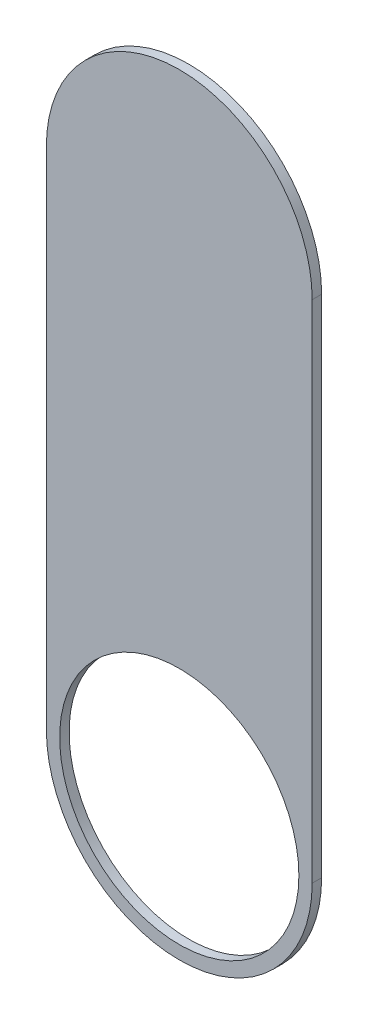
ISO-10303-21;
HEADER;
FILE_DESCRIPTION(('STEP AP214'),'2;1');
FILE_NAME('part.step','',(''),(''),'','','');
FILE_SCHEMA(('AUTOMOTIVE_DESIGN { 1 0 10303 214 1 1 1 1 }'));
ENDSEC;
DATA;
#1=APPLICATION_CONTEXT('core data for automotive mechanical design processes');
#2=APPLICATION_PROTOCOL_DEFINITION('international standard','automotive_design',2000,#1);
#3=PRODUCT_CONTEXT('',#1,'mechanical');
#4=PRODUCT('Part','Part','',(#3));
#5=PRODUCT_RELATED_PRODUCT_CATEGORY('part','',(#4));
#6=PRODUCT_DEFINITION_FORMATION('','',#4);
#7=PRODUCT_DEFINITION_CONTEXT('part definition',#1,'design');
#8=PRODUCT_DEFINITION('design','',#6,#7);
#9=PRODUCT_DEFINITION_SHAPE('','',#8);
#10=(LENGTH_UNIT() NAMED_UNIT(*) SI_UNIT(.MILLI.,.METRE.));
#11=(NAMED_UNIT(*) PLANE_ANGLE_UNIT() SI_UNIT($,.RADIAN.));
#12=(NAMED_UNIT(*) SI_UNIT($,.STERADIAN.) SOLID_ANGLE_UNIT());
#13=UNCERTAINTY_MEASURE_WITH_UNIT(LENGTH_MEASURE(1.E-05),#10,'distance_accuracy_value','');
#14=(GEOMETRIC_REPRESENTATION_CONTEXT(3) GLOBAL_UNCERTAINTY_ASSIGNED_CONTEXT((#13)) GLOBAL_UNIT_ASSIGNED_CONTEXT((#10,
#11,#12)) REPRESENTATION_CONTEXT('',''));
#15=CARTESIAN_POINT('',(0.,0.,0.));
#16=DIRECTION('',(0.,0.,1.));
#17=DIRECTION('',(1.,0.,0.));
#18=AXIS2_PLACEMENT_3D('',#15,#16,#17);
#19=CARTESIAN_POINT('',(97.859977,116.4999956,0.));
#20=DIRECTION('',(-1.,0.,0.));
#21=DIRECTION('',(0.,1.,0.));
#22=AXIS2_PLACEMENT_3D('',#19,#20,#21);
#23=PLANE('',#22);
#24=DIRECTION('',(0.,1.,0.));
#25=VECTOR('',#24,1.);
#26=CARTESIAN_POINT('',(97.859977,116.4999956,0.03556));
#27=LINE('',#26,#25);
#28=CARTESIAN_POINT('',(97.859977,116.4999956,0.03556));
#29=VERTEX_POINT('',#28);
#30=CARTESIAN_POINT('',(97.859977,118.4012364,0.03556));
#31=VERTEX_POINT('',#30);
#32=EDGE_CURVE('E11',#29,#31,#27,.T.);
#33=ORIENTED_EDGE('',*,*,#32,.F.);
#34=DIRECTION('',(0.,0.,1.));
#35=VECTOR('',#34,1.);
#36=CARTESIAN_POINT('',(97.859977,116.4999956,0.));
#37=LINE('',#36,#35);
#38=CARTESIAN_POINT('',(97.859977,116.4999956,0.));
#39=VERTEX_POINT('',#38);
#40=EDGE_CURVE('E24',#39,#29,#37,.T.);
#41=ORIENTED_EDGE('',*,*,#40,.F.);
#42=DIRECTION('',(0.,1.,0.));
#43=VECTOR('',#42,1.);
#44=CARTESIAN_POINT('',(97.859977,116.4999956,0.));
#45=LINE('',#44,#43);
#46=CARTESIAN_POINT('',(97.859977,118.4012364,0.));
#47=VERTEX_POINT('',#46);
#48=EDGE_CURVE('E96',#39,#47,#45,.T.);
#49=ORIENTED_EDGE('',*,*,#48,.T.);
#50=DIRECTION('',(0.,0.,1.));
#51=VECTOR('',#50,1.);
#52=CARTESIAN_POINT('',(97.859977,118.4012364,0.));
#53=LINE('',#52,#51);
#54=EDGE_CURVE('E37',#47,#31,#53,.T.);
#55=ORIENTED_EDGE('',*,*,#54,.T.);
#56=EDGE_LOOP('',(#33,#41,#49,#55));
#57=FACE_BOUND('',#56,.T.);
#58=ADVANCED_FACE('F17',(#57),#23,.F.);
#59=CARTESIAN_POINT('',(97.359978,116.4999956,0.));
#60=DIRECTION('',(0.,0.,-1.));
#61=DIRECTION('',(-1.,0.,0.));
#62=AXIS2_PLACEMENT_3D('',#59,#60,#61);
#63=CYLINDRICAL_SURFACE('',#62,0.499998999999993);
#64=CARTESIAN_POINT('',(97.359978,116.4999956,0.03556));
#65=DIRECTION('',(0.,0.,1.));
#66=DIRECTION('',(-1.,0.,0.));
#67=AXIS2_PLACEMENT_3D('',#64,#65,#66);
#68=CIRCLE('',#67,0.499998999999993);
#69=CARTESIAN_POINT('',(96.859979,116.4999956,0.03556));
#70=VERTEX_POINT('',#69);
#71=EDGE_CURVE('E92',#70,#29,#68,.T.);
#72=ORIENTED_EDGE('',*,*,#71,.F.);
#73=DIRECTION('',(0.,0.,1.));
#74=VECTOR('',#73,1.);
#75=CARTESIAN_POINT('',(96.859979,116.4999956,0.));
#76=LINE('',#75,#74);
#77=CARTESIAN_POINT('',(96.859979,116.4999956,0.));
#78=VERTEX_POINT('',#77);
#79=EDGE_CURVE('E90',#78,#70,#76,.T.);
#80=ORIENTED_EDGE('',*,*,#79,.F.);
#81=CARTESIAN_POINT('',(97.359978,116.4999956,0.));
#82=DIRECTION('',(0.,0.,1.));
#83=DIRECTION('',(-1.,0.,0.));
#84=AXIS2_PLACEMENT_3D('',#81,#82,#83);
#85=CIRCLE('',#84,0.499998999999993);
#86=EDGE_CURVE('E88',#78,#39,#85,.T.);
#87=ORIENTED_EDGE('',*,*,#86,.T.);
#88=ORIENTED_EDGE('',*,*,#40,.T.);
#89=EDGE_LOOP('',(#72,#80,#87,#88));
#90=FACE_BOUND('',#89,.T.);
#91=ADVANCED_FACE('F111',(#90),#63,.T.);
#92=CARTESIAN_POINT('',(97.359978,118.4012364,0.));
#93=DIRECTION('',(0.,0.,-1.));
#94=DIRECTION('',(1.,0.,0.));
#95=AXIS2_PLACEMENT_3D('',#92,#93,#94);
#96=CYLINDRICAL_SURFACE('',#95,0.499998999999993);
#97=CARTESIAN_POINT('',(97.359978,118.4012364,0.03556));
#98=DIRECTION('',(0.,0.,1.));
#99=DIRECTION('',(1.,0.,0.));
#100=AXIS2_PLACEMENT_3D('',#97,#98,#99);
#101=CIRCLE('',#100,0.499998999999993);
#102=CARTESIAN_POINT('',(96.859979,118.4012364,0.03556));
#103=VERTEX_POINT('',#102);
#104=EDGE_CURVE('E85',#31,#103,#101,.T.);
#105=ORIENTED_EDGE('',*,*,#104,.F.);
#106=ORIENTED_EDGE('',*,*,#54,.F.);
#107=CARTESIAN_POINT('',(97.359978,118.4012364,0.));
#108=DIRECTION('',(0.,0.,1.));
#109=DIRECTION('',(1.,0.,0.));
#110=AXIS2_PLACEMENT_3D('',#107,#108,#109);
#111=CIRCLE('',#110,0.499998999999993);
#112=CARTESIAN_POINT('',(96.859979,118.4012364,0.));
#113=VERTEX_POINT('',#112);
#114=EDGE_CURVE('E82',#47,#113,#111,.T.);
#115=ORIENTED_EDGE('',*,*,#114,.T.);
#116=DIRECTION('',(0.,0.,1.));
#117=VECTOR('',#116,1.);
#118=CARTESIAN_POINT('',(96.859979,118.4012364,0.));
#119=LINE('',#118,#117);
#120=EDGE_CURVE('E80',#113,#103,#119,.T.);
#121=ORIENTED_EDGE('',*,*,#120,.T.);
#122=EDGE_LOOP('',(#105,#106,#115,#121));
#123=FACE_BOUND('',#122,.T.);
#124=ADVANCED_FACE('F104',(#123),#96,.T.);
#125=CARTESIAN_POINT('',(96.859979,118.4012364,0.));
#126=DIRECTION('',(1.,0.,0.));
#127=DIRECTION('',(0.,-1.,0.));
#128=AXIS2_PLACEMENT_3D('',#125,#126,#127);
#129=PLANE('',#128);
#130=DIRECTION('',(0.,-1.,0.));
#131=VECTOR('',#130,1.);
#132=CARTESIAN_POINT('',(96.859979,118.4012364,0.03556));
#133=LINE('',#132,#131);
#134=EDGE_CURVE('E77',#103,#70,#133,.T.);
#135=ORIENTED_EDGE('',*,*,#134,.F.);
#136=ORIENTED_EDGE('',*,*,#120,.F.);
#137=DIRECTION('',(0.,-1.,0.));
#138=VECTOR('',#137,1.);
#139=CARTESIAN_POINT('',(96.859979,118.4012364,0.));
#140=LINE('',#139,#138);
#141=EDGE_CURVE('E68',#113,#78,#140,.T.);
#142=ORIENTED_EDGE('',*,*,#141,.T.);
#143=ORIENTED_EDGE('',*,*,#79,.T.);
#144=EDGE_LOOP('',(#135,#136,#142,#143));
#145=FACE_BOUND('',#144,.T.);
#146=ADVANCED_FACE('F110',(#145),#129,.F.);
#147=CARTESIAN_POINT('',(97.359978,116.4999956,0.));
#148=DIRECTION('',(0.,0.,-1.));
#149=DIRECTION('',(1.,0.,0.));
#150=AXIS2_PLACEMENT_3D('',#147,#148,#149);
#151=CYLINDRICAL_SURFACE('',#150,0.4499991);
#152=DIRECTION('',(0.,0.,1.));
#153=VECTOR('',#152,1.);
#154=CARTESIAN_POINT('',(97.8099771,116.4999956,0.));
#155=LINE('',#154,#153);
#156=CARTESIAN_POINT('',(97.8099771,116.4999956,0.));
#157=VERTEX_POINT('',#156);
#158=CARTESIAN_POINT('',(97.8099771,116.4999956,0.03556));
#159=VERTEX_POINT('',#158);
#160=EDGE_CURVE('E62',#157,#159,#155,.T.);
#161=ORIENTED_EDGE('',*,*,#160,.T.);
#162=CARTESIAN_POINT('',(97.359978,116.4999956,0.03556));
#163=DIRECTION('',(0.,0.,1.));
#164=DIRECTION('',(1.,0.,0.));
#165=AXIS2_PLACEMENT_3D('',#162,#163,#164);
#166=CIRCLE('',#165,0.4499991);
#167=EDGE_CURVE('E67',#159,#159,#166,.T.);
#168=ORIENTED_EDGE('',*,*,#167,.T.);
#169=ORIENTED_EDGE('',*,*,#160,.F.);
#170=CARTESIAN_POINT('',(97.359978,116.4999956,0.));
#171=DIRECTION('',(0.,0.,1.));
#172=DIRECTION('',(1.,0.,0.));
#173=AXIS2_PLACEMENT_3D('',#170,#171,#172);
#174=CIRCLE('',#173,0.4499991);
#175=EDGE_CURVE('E65',#157,#157,#174,.T.);
#176=ORIENTED_EDGE('',*,*,#175,.F.);
#177=EDGE_LOOP('',(#161,#168,#169,#176));
#178=FACE_BOUND('',#177,.T.);
#179=ADVANCED_FACE('F64',(#178),#151,.F.);
#180=CARTESIAN_POINT('',(97.859977,116.4999956,0.));
#181=DIRECTION('',(0.,0.,-1.));
#182=DIRECTION('',(-1.,0.,0.));
#183=AXIS2_PLACEMENT_3D('',#180,#181,#182);
#184=PLANE('',#183);
#185=ORIENTED_EDGE('',*,*,#48,.F.);
#186=ORIENTED_EDGE('',*,*,#86,.F.);
#187=ORIENTED_EDGE('',*,*,#141,.F.);
#188=ORIENTED_EDGE('',*,*,#114,.F.);
#189=EDGE_LOOP('',(#185,#186,#187,#188));
#190=FACE_BOUND('',#189,.T.);
#191=ORIENTED_EDGE('',*,*,#175,.T.);
#192=EDGE_LOOP('',(#191));
#193=FACE_BOUND('',#192,.T.);
#194=ADVANCED_FACE('F71',(#190,#193),#184,.T.);
#195=CARTESIAN_POINT('',(97.859977,116.4999956,0.03556));
#196=DIRECTION('',(0.,0.,-1.));
#197=DIRECTION('',(-1.,0.,0.));
#198=AXIS2_PLACEMENT_3D('',#195,#196,#197);
#199=PLANE('',#198);
#200=ORIENTED_EDGE('',*,*,#134,.T.);
#201=ORIENTED_EDGE('',*,*,#71,.T.);
#202=ORIENTED_EDGE('',*,*,#32,.T.);
#203=ORIENTED_EDGE('',*,*,#104,.T.);
#204=EDGE_LOOP('',(#200,#201,#202,#203));
#205=FACE_BOUND('',#204,.T.);
#206=ORIENTED_EDGE('',*,*,#167,.F.);
#207=EDGE_LOOP('',(#206));
#208=FACE_BOUND('',#207,.T.);
#209=ADVANCED_FACE('F107',(#205,#208),#199,.F.);
#210=CLOSED_SHELL('',(#58,#91,#124,#146,#179,#194,#209));
#211=MANIFOLD_SOLID_BREP('B1',#210);
#212=ADVANCED_BREP_SHAPE_REPRESENTATION('',(#18,#211),#14);
#213=SHAPE_DEFINITION_REPRESENTATION(#9,#212);
ENDSEC;
END-ISO-10303-21;
